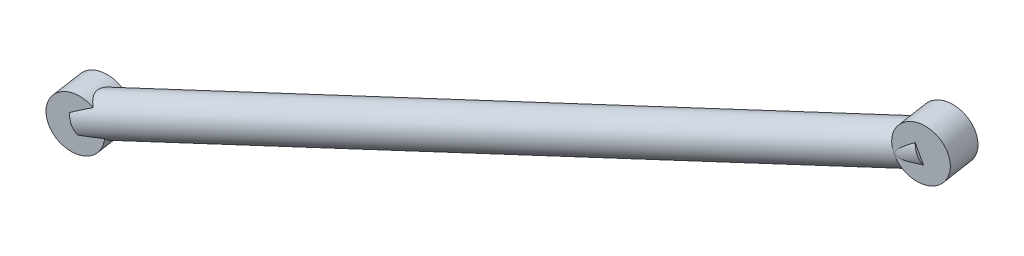
ISO-10303-21;
HEADER;
FILE_DESCRIPTION(('STEP AP214'),'2;1');
FILE_NAME('part.step','',(''),(''),'','','');
FILE_SCHEMA(('AUTOMOTIVE_DESIGN { 1 0 10303 214 1 1 1 1 }'));
ENDSEC;
DATA;
#1=APPLICATION_CONTEXT('core data for automotive mechanical design processes');
#2=APPLICATION_PROTOCOL_DEFINITION('international standard','automotive_design',2000,#1);
#3=PRODUCT_CONTEXT('',#1,'mechanical');
#4=PRODUCT('Part','Part','',(#3));
#5=PRODUCT_RELATED_PRODUCT_CATEGORY('part','',(#4));
#6=PRODUCT_DEFINITION_FORMATION('','',#4);
#7=PRODUCT_DEFINITION_CONTEXT('part definition',#1,'design');
#8=PRODUCT_DEFINITION('design','',#6,#7);
#9=PRODUCT_DEFINITION_SHAPE('','',#8);
#10=(LENGTH_UNIT() NAMED_UNIT(*) SI_UNIT(.MILLI.,.METRE.));
#11=(NAMED_UNIT(*) PLANE_ANGLE_UNIT() SI_UNIT($,.RADIAN.));
#12=(NAMED_UNIT(*) SI_UNIT($,.STERADIAN.) SOLID_ANGLE_UNIT());
#13=UNCERTAINTY_MEASURE_WITH_UNIT(LENGTH_MEASURE(1.E-05),#10,'distance_accuracy_value','');
#14=(GEOMETRIC_REPRESENTATION_CONTEXT(3) GLOBAL_UNCERTAINTY_ASSIGNED_CONTEXT((#13)) GLOBAL_UNIT_ASSIGNED_CONTEXT((#10,
#11,#12)) REPRESENTATION_CONTEXT('',''));
#15=CARTESIAN_POINT('',(0.,0.,0.));
#16=DIRECTION('',(0.,0.,1.));
#17=DIRECTION('',(1.,0.,0.));
#18=AXIS2_PLACEMENT_3D('',#15,#16,#17);
#19=CARTESIAN_POINT('',(175.,1319.6,-94.));
#20=DIRECTION('',(0.912250150157576,0.407836306683906,-0.0383302816048973));
#21=DIRECTION('',(-0.408136235908337,0.912921033243607,0.));
#22=AXIS2_PLACEMENT_3D('',#19,#20,#21);
#23=PLANE('',#22);
#24=DIRECTION('',(-0.405264883425802,0.9121907599121,0.060567250167539));
#25=VECTOR('',#24,1.);
#26=CARTESIAN_POINT('',(175.419638353964,1319.32065466055,-86.9849724910181));
#27=LINE('',#26,#25);
#28=CARTESIAN_POINT('',(176.964716176824,1315.84291511045,-87.2158859475072));
#29=VERTEX_POINT('',#28);
#30=CARTESIAN_POINT('',(173.874560531103,1322.79839421066,-86.7540590345291));
#31=VERTEX_POINT('',#30);
#32=EDGE_CURVE('E214',#29,#31,#27,.T.);
#33=ORIENTED_EDGE('',*,*,#32,.F.);
#34=CARTESIAN_POINT('',(175.,1319.6,-94.));
#35=DIRECTION('',(0.912250150157576,0.407836306683906,-0.0383302816048973));
#36=DIRECTION('',(-0.408136235908337,0.912921033243607,0.));
#37=AXIS2_PLACEMENT_3D('',#34,#35,#36);
#38=CIRCLE('',#37,8.00000000000001);
#39=EDGE_CURVE('E121',#31,#29,#38,.T.);
#40=ORIENTED_EDGE('',*,*,#39,.F.);
#41=EDGE_LOOP('',(#33,#40));
#42=FACE_BOUND('',#41,.T.);
#43=ADVANCED_FACE('F61',(#42),#23,.F.);
#44=CARTESIAN_POINT('',(175.,1319.6,-94.));
#45=DIRECTION('',(0.912250150157576,0.407836306683905,-0.0383302816048975));
#46=DIRECTION('',(-0.408136235908336,0.912921033243607,0.));
#47=AXIS2_PLACEMENT_3D('',#44,#45,#46);
#48=CYLINDRICAL_SURFACE('',#47,8.00000000000001);
#49=CARTESIAN_POINT('',(454.929916770915,1444.74723441423,-105.761897257689));
#50=DIRECTION('',(-0.147809429099499,0.,-0.989015860676299));
#51=DIRECTION('',(0.902171129515433,0.409765808152639,-0.134830395452446));
#52=AXIS2_PLACEMENT_3D('',#49,#50,#51);
#53=ELLIPSE('',#52,82.5338575678715,8.00000000000001);
#54=CARTESIAN_POINT('',(513.188387094106,1465.44539915011,-114.468685066726));
#55=VERTEX_POINT('',#54);
#56=CARTESIAN_POINT('',(521.935439468897,1471.00160578934,-115.775940965471));
#57=VERTEX_POINT('',#56);
#58=EDGE_CURVE('E82',#55,#57,#53,.F.);
#59=ORIENTED_EDGE('',*,*,#58,.F.);
#60=CARTESIAN_POINT('',(508.92760737851,1475.03577829605,-113.831907192557));
#61=CARTESIAN_POINT('',(508.94827239053,1475.14104204418,-113.747901744597));
#62=CARTESIAN_POINT('',(508.970602457118,1475.24457810792,-113.662175996066));
#63=CARTESIAN_POINT('',(509.018282818112,1475.44805471552,-113.487381054098));
#64=CARTESIAN_POINT('',(509.04363283287,1475.54799559118,-113.398312170759));
#65=CARTESIAN_POINT('',(509.123765085911,1475.84228360062,-113.126176103404));
#66=CARTESIAN_POINT('',(509.182620942872,1476.03105351941,-112.938213484238));
#67=CARTESIAN_POINT('',(509.309266939728,1476.39420062844,-112.547816686035));
#68=CARTESIAN_POINT('',(509.377144877647,1476.56840474467,-112.345250626928));
#69=CARTESIAN_POINT('',(509.518563829719,1476.8985204511,-111.927608114368));
#70=CARTESIAN_POINT('',(509.592103262384,1477.05443711925,-111.712535158683));
#71=CARTESIAN_POINT('',(509.723909066588,1477.31101409643,-111.322680807913));
#72=CARTESIAN_POINT('',(509.781630075913,1477.41597942264,-111.15053911796));
#73=CARTESIAN_POINT('',(509.89709097049,1477.61284825433,-110.798851994838));
#74=CARTESIAN_POINT('',(509.954830857211,1477.7047491542,-110.619305093942));
#75=CARTESIAN_POINT('',(510.068427374444,1477.873620096,-110.253595665571));
#76=CARTESIAN_POINT('',(510.124290265577,1477.95064493822,-110.067460528573));
#77=CARTESIAN_POINT('',(510.23252790108,1478.0883970531,-109.688290557377));
#78=CARTESIAN_POINT('',(510.284904120696,1478.14913125187,-109.495258695067));
#79=CARTESIAN_POINT('',(510.373254419953,1478.24093392383,-109.146595966626));
#80=CARTESIAN_POINT('',(510.410288182386,1478.27559507508,-108.992177453888));
#81=CARTESIAN_POINT('',(510.480249803723,1478.3330170309,-108.680283306352));
#82=CARTESIAN_POINT('',(510.513179741872,1478.35578388066,-108.522809266795));
#83=CARTESIAN_POINT('',(510.574199270502,1478.38867650542,-108.205737693436));
#84=CARTESIAN_POINT('',(510.602292802627,1478.39881261683,-108.046142004148));
#85=CARTESIAN_POINT('',(510.653161929173,1478.40597560667,-107.72580064502));
#86=CARTESIAN_POINT('',(510.675937484201,1478.403002388,-107.565054966671));
#87=CARTESIAN_POINT('',(510.715987812946,1478.38376410923,-107.24340209768));
#88=CARTESIAN_POINT('',(510.733253422397,1478.36747706384,-107.082495079894));
#89=CARTESIAN_POINT('',(510.762351168827,1478.32178872799,-106.762068779726));
#90=CARTESIAN_POINT('',(510.774183323274,1478.2923874797,-106.602549492883));
#91=CARTESIAN_POINT('',(510.792857392162,1478.22096406807,-106.285884385166));
#92=CARTESIAN_POINT('',(510.799693471077,1478.17892722666,-106.128741549078));
#93=CARTESIAN_POINT('',(510.809033135946,1478.08299464735,-105.817915502998));
#94=CARTESIAN_POINT('',(510.811534158082,1478.02909191301,-105.664234393312));
#95=CARTESIAN_POINT('',(510.813230146254,1477.89385782252,-105.319135187567));
#96=CARTESIAN_POINT('',(510.811316493742,1477.80906513074,-105.129065247495));
#97=CARTESIAN_POINT('',(510.803625343981,1477.62348581561,-104.756963249736));
#98=CARTESIAN_POINT('',(510.797846290203,1477.52269276168,-104.574934461565));
#99=CARTESIAN_POINT('',(510.784259376796,1477.30676985784,-104.21942808297));
#100=CARTESIAN_POINT('',(510.776449274001,1477.19162423009,-104.045960201154));
#101=CARTESIAN_POINT('',(510.760514660885,1476.94862341534,-103.708232095137));
#102=CARTESIAN_POINT('',(510.752390169488,1476.82076899264,-103.543971318156));
#103=CARTESIAN_POINT('',(510.737185150884,1476.55035297279,-103.221047435995));
#104=CARTESIAN_POINT('',(510.730135211964,1476.40750700896,-103.062621344287));
#105=CARTESIAN_POINT('',(510.718807922928,1476.11095991644,-102.75606508081));
#106=CARTESIAN_POINT('',(510.714531636833,1475.95725464698,-102.607938879687));
#107=CARTESIAN_POINT('',(510.710087740887,1475.64008692409,-102.322472967149));
#108=CARTESIAN_POINT('',(510.709919939745,1475.47662492529,-102.185132753833));
#109=CARTESIAN_POINT('',(510.714891779445,1475.14091229328,-101.921752850433));
#110=CARTESIAN_POINT('',(510.720031510886,1474.96866151008,-101.795713353294));
#111=CARTESIAN_POINT('',(510.738249398309,1474.58375247265,-101.533361544772));
#112=CARTESIAN_POINT('',(510.752618434016,1474.3695070987,-101.399451507119));
#113=CARTESIAN_POINT('',(510.791948971423,1473.93165833222,-101.149588266351));
#114=CARTESIAN_POINT('',(510.816911862281,1473.7080537159,-101.033637420924));
#115=CARTESIAN_POINT('',(510.878787543275,1473.2534846634,-100.821150626652));
#116=CARTESIAN_POINT('',(510.915694824227,1473.02252366444,-100.724605760286));
#117=CARTESIAN_POINT('',(511.002542294851,1472.55534160107,-100.55234779404));
#118=CARTESIAN_POINT('',(511.052479965676,1472.31912156133,-100.476630673845));
#119=CARTESIAN_POINT('',(511.160239811803,1471.86838560612,-100.354074557266));
#120=CARTESIAN_POINT('',(511.216721142409,1471.6541386701,-100.305065163351));
#121=CARTESIAN_POINT('',(511.340937389755,1471.22542096603,-100.225798481486));
#122=CARTESIAN_POINT('',(511.408671639686,1471.01095021201,-100.195540082918));
#123=CARTESIAN_POINT('',(511.555184122622,1470.58414999344,-100.154434706181));
#124=CARTESIAN_POINT('',(511.633951740191,1470.37181867853,-100.14356920617));
#125=CARTESIAN_POINT('',(511.802078106373,1469.9513037644,-100.141517852386));
#126=CARTESIAN_POINT('',(511.891435547733,1469.74311965692,-100.150329571965));
#127=CARTESIAN_POINT('',(512.066779825584,1469.36154266324,-100.184984008825));
#128=CARTESIAN_POINT('',(512.151509733652,1469.18733501247,-100.208290103269));
#129=CARTESIAN_POINT('',(512.327466087526,1468.84479796546,-100.269194727032));
#130=CARTESIAN_POINT('',(512.418692426906,1468.676468473,-100.306793022255));
#131=CARTESIAN_POINT('',(512.606782725153,1468.34678580389,-100.395848491438));
#132=CARTESIAN_POINT('',(512.703646602405,1468.18543252631,-100.447305464804));
#133=CARTESIAN_POINT('',(512.902066552696,1467.87058893025,-100.563495547532));
#134=CARTESIAN_POINT('',(513.003622814239,1467.71709892818,-100.628229190612));
#135=CARTESIAN_POINT('',(513.210208998126,1467.41898513579,-100.77014123475));
#136=CARTESIAN_POINT('',(513.315231306956,1467.27434367573,-100.847293637362));
#137=CARTESIAN_POINT('',(513.52793446366,1466.99404255133,-101.013403560402));
#138=CARTESIAN_POINT('',(513.635616181185,1466.85838587995,-101.10236498523));
#139=CARTESIAN_POINT('',(513.961005947855,1466.46552386831,-101.385755961767));
#140=CARTESIAN_POINT('',(514.181228069705,1466.22218555481,-101.596808736703));
#141=CARTESIAN_POINT('',(514.646935938207,1465.74600469671,-102.085700864432));
#142=CARTESIAN_POINT('',(514.892203844163,1465.51811882753,-102.368558603308));
#143=CARTESIAN_POINT('',(515.249682787173,1465.21100267882,-102.824411827434));
#144=CARTESIAN_POINT('',(515.36725848149,1465.11430800296,-102.981860370423));
#145=CARTESIAN_POINT('',(515.597277704326,1464.93222001145,-103.306702443493));
#146=CARTESIAN_POINT('',(515.709722652816,1464.84682355637,-103.474093192112));
#147=CARTESIAN_POINT('',(515.943280810777,1464.6755702913,-103.842862605121));
#148=CARTESIAN_POINT('',(516.063344775489,1464.59138312342,-104.045684801862));
#149=CARTESIAN_POINT('',(516.29152477494,1464.43670291749,-104.463057609484));
#150=CARTESIAN_POINT('',(516.399637455679,1464.36621371943,-104.677611487615));
#151=CARTESIAN_POINT('',(516.600115482204,1464.23855909154,-105.117189013176));
#152=CARTESIAN_POINT('',(516.69251534959,1464.18136434909,-105.342188288969));
#153=CARTESIAN_POINT('',(516.857716941731,1464.07963435594,-105.801992247924));
#154=CARTESIAN_POINT('',(516.930532083306,1464.03509043743,-106.036790090393));
#155=CARTESIAN_POINT('',(517.03112940157,1463.97148582232,-106.431954293339));
#156=CARTESIAN_POINT('',(517.065779877854,1463.9489365137,-106.59003172635));
#157=CARTESIAN_POINT('',(517.123553222489,1463.90896113658,-106.908901109632));
#158=CARTESIAN_POINT('',(517.146679723808,1463.89153345418,-107.06969218787));
#159=CARTESIAN_POINT('',(517.180311030557,1463.86172217906,-107.392799998716));
#160=CARTESIAN_POINT('',(517.19083640463,1463.84933038823,-107.555113808031));
#161=CARTESIAN_POINT('',(517.198563963947,1463.82945476166,-107.880374220758));
#162=CARTESIAN_POINT('',(517.195765953529,1463.82197099801,-108.043320833429));
#163=CARTESIAN_POINT('',(517.176476990976,1463.81180251712,-108.369052025174));
#164=CARTESIAN_POINT('',(517.159944557751,1463.80913241579,-108.531834615847));
#165=CARTESIAN_POINT('',(517.113299604495,1463.80854237065,-108.855440150396));
#166=CARTESIAN_POINT('',(517.083187297575,1463.8106223523,-109.016263124985));
#167=CARTESIAN_POINT('',(517.010004175856,1463.81945094657,-109.334912333248));
#168=CARTESIAN_POINT('',(516.966923827347,1463.82620299872,-109.492736271059));
#169=CARTESIAN_POINT('',(516.868816630217,1463.84431717366,-109.804413715384));
#170=CARTESIAN_POINT('',(516.813783565594,1463.85568169784,-109.958265109225));
#171=CARTESIAN_POINT('',(516.676333523091,1463.88675800202,-110.303137836716));
#172=CARTESIAN_POINT('',(516.590551274764,1463.90790825932,-110.492690480365));
#173=CARTESIAN_POINT('',(516.404279661776,1463.95767440638,-110.863422319406));
#174=CARTESIAN_POINT('',(516.303783771969,1463.98629361288,-111.044597752556));
#175=CARTESIAN_POINT('',(516.090249139468,1464.05124652989,-111.399014041634));
#176=CARTESIAN_POINT('',(515.977157564709,1464.08761336719,-111.572216813372));
#177=CARTESIAN_POINT('',(515.741159318536,1464.16817741555,-111.909786586446));
#178=CARTESIAN_POINT('',(515.618254471658,1464.21237317288,-112.074155220807));
#179=CARTESIAN_POINT('',(515.317249319819,1464.32690749622,-112.453981019695));
#180=CARTESIAN_POINT('',(515.13566914924,1464.40084684345,-112.66560927755));
#181=CARTESIAN_POINT('',(514.762035365107,1464.56496707543,-113.072762256814));
#182=CARTESIAN_POINT('',(514.569977784381,1464.65515414239,-113.268280807102));
#183=CARTESIAN_POINT('',(514.18135192718,1464.8516548972,-113.640827869998));
#184=CARTESIAN_POINT('',(513.984866074554,1464.95776079811,-113.818051073051));
#185=CARTESIAN_POINT('',(513.687574438672,1465.13034372337,-114.071487494115));
#186=CARTESIAN_POINT('',(513.588068532209,1465.19009654569,-114.153885955253));
#187=CARTESIAN_POINT('',(513.388531569595,1465.31423602692,-114.314471597459));
#188=CARTESIAN_POINT('',(513.288500461707,1465.3786231506,-114.392658354758));
#189=CARTESIAN_POINT('',(513.188387094106,1465.44539915011,-114.468685066726));
#190=B_SPLINE_CURVE_WITH_KNOTS('',3,(#60,#61,#62,#63,#64,#65,#66,#67,#68,#69,#70,#71,#72,#73,
#74,#75,#76,#77,#78,#79,#80,#81,#82,#83,#84,#85,#86,#87,#88,#89,#90,#91,#92,#93,#94,#95,#96,#97,
#98,#99,#100,#101,#102,#103,#104,#105,#106,#107,#108,#109,#110,#111,#112,#113,#114,#115,#116,
#117,#118,#119,#120,#121,#122,#123,#124,#125,#126,#127,#128,#129,#130,#131,#132,#133,#134,#135,
#136,#137,#138,#139,#140,#141,#142,#143,#144,#145,#146,#147,#148,#149,#150,#151,#152,#153,#154,
#155,#156,#157,#158,#159,#160,#161,#162,#163,#164,#165,#166,#167,#168,#169,#170,#171,#172,#173,
#174,#175,#176,#177,#178,#179,#180,#181,#182,#183,#184,#185,#186,#187,#188,#189),.UNSPECIFIED.,
.F.,.F.,(4,2,2,2,2,2,2,2,2,2,2,2,2,2,2,2,2,2,2,2,2,2,2,2,2,2,2,2,2,2,2,2,2,2,2,2,2,2,2,2,2,2,2,
2,2,2,2,2,2,2,2,2,2,2,2,2,2,2,2,2,2,2,2,2,4),(0.,0.408682242264113,0.817326669733562,
1.63478049720215,2.46086825513354,3.28672608429655,3.91541272958496,4.54422458639402,
5.17067389800407,5.79685644532747,6.28400064584877,6.77089701742648,7.25739467301195,
7.74389593226042,8.2312021844088,8.71850686989097,9.20637983228177,9.6945412317404,
10.3180211431972,10.9417522700553,11.5661752162147,12.190560632765,12.8303016713009,
13.4702879805195,14.1102444918356,14.750211927508,15.5083802863279,16.266648093455,
17.0245666573347,17.7823388197515,18.4621041593567,19.1418292327186,19.8209047635675,
20.4998965535665,21.0845411470313,21.669176164902,22.2538027210984,22.8384527836689,
23.4218944408868,24.0055294832906,25.1718591096603,26.4813856612201,27.1379421726912,
27.7943158612193,28.5442547071669,29.2944034839999,30.0428822459093,30.7908469372594,
31.2805847842234,31.7701681420377,32.2589512655469,32.747741567218,33.2380135170277,
33.7282777731729,34.2189033406532,34.7097846711704,35.3362294811975,35.9629529507342,
36.5924119223248,37.2217541329407,38.0859859476797,38.9505472979784,39.8046734058604,
40.2315802031332,40.6585298744864),.UNSPECIFIED.);
#191=CARTESIAN_POINT('',(508.92760737851,1475.03577829605,-113.831907192557));
#192=VERTEX_POINT('',#191);
#193=EDGE_CURVE('E12',#192,#55,#190,.T.);
#194=ORIENTED_EDGE('',*,*,#193,.F.);
#195=CARTESIAN_POINT('',(518.845283823176,1477.95708488955,-115.314114052493));
#196=VERTEX_POINT('',#195);
#197=EDGE_CURVE('E123',#196,#192,#53,.F.);
#198=ORIENTED_EDGE('',*,*,#197,.F.);
#199=CARTESIAN_POINT('',(520.81,1474.2,-108.53));
#200=DIRECTION('',(0.912250150157576,0.407836306683906,-0.0383302816048973));
#201=DIRECTION('',(-0.408136235908337,0.912921033243607,0.));
#202=AXIS2_PLACEMENT_3D('',#199,#200,#201);
#203=CIRCLE('',#202,8.00000000000001);
#204=EDGE_CURVE('E116',#57,#196,#203,.T.);
#205=ORIENTED_EDGE('',*,*,#204,.F.);
#206=EDGE_LOOP('',(#59,#194,#198,#205));
#207=FACE_BOUND('',#206,.T.);
#208=CARTESIAN_POINT('',(182.621612905893,1328.35460084989,-88.0613149332738));
#209=CARTESIAN_POINT('',(182.525784393692,1328.41851892123,-88.1340871194705));
#210=CARTESIAN_POINT('',(182.430030687432,1328.48024851067,-88.2088396301664));
#211=CARTESIAN_POINT('',(182.238989369884,1328.59945601721,-88.3622091309601));
#212=CARTESIAN_POINT('',(182.143701716289,1328.65693432719,-88.4408257628431));
#213=CARTESIAN_POINT('',(181.858947537276,1328.82321972981,-88.6823808746626));
#214=CARTESIAN_POINT('',(181.670628725055,1328.92585159876,-88.8509951231232));
#215=CARTESIAN_POINT('',(181.297922488417,1329.1165493608,-89.204617967528));
#216=CARTESIAN_POINT('',(181.113597595218,1329.20444995922,-89.3897809104008));
#217=CARTESIAN_POINT('',(180.754055502001,1329.36529688492,-89.7748246970473));
#218=CARTESIAN_POINT('',(180.578835781276,1329.43824736767,-89.974701429976));
#219=CARTESIAN_POINT('',(180.281484710925,1329.55428807415,-90.3398148718765));
#220=CARTESIAN_POINT('',(180.156666222703,1329.60034915749,-90.5019287751745));
#221=CARTESIAN_POINT('',(179.916310467954,1329.68460001337,-90.83495023406));
#222=CARTESIAN_POINT('',(179.80077505486,1329.7227882164,-91.0058595345927));
#223=CARTESIAN_POINT('',(179.581683348611,1329.79137119812,-91.3558025993684));
#224=CARTESIAN_POINT('',(179.478083678939,1329.82179471886,-91.5348034261259));
#225=CARTESIAN_POINT('',(179.284937720224,1329.87515856552,-91.9012837618177));
#226=CARTESIAN_POINT('',(179.195385465539,1329.89810207254,-92.0887596277698));
#227=CARTESIAN_POINT('',(179.051064991219,1329.93227991014,-92.429057556462));
#228=CARTESIAN_POINT('',(178.992988414514,1329.94498299282,-92.5803311991454));
#229=CARTESIAN_POINT('',(178.888240995336,1329.96585867557,-92.8870265737151));
#230=CARTESIAN_POINT('',(178.84156436536,1329.97403357718,-93.0424461561575));
#231=CARTESIAN_POINT('',(178.760703530428,1329.98580077126,-93.3565524260528));
#232=CARTESIAN_POINT('',(178.726509126815,1329.98939681091,-93.5152363338745));
#233=CARTESIAN_POINT('',(178.671327383945,1329.99194087668,-93.8349331680942));
#234=CARTESIAN_POINT('',(178.650340142518,1329.99088886837,-93.9959461117354));
#235=CARTESIAN_POINT('',(178.621879045706,1329.98404151595,-94.3193310032593));
#236=CARTESIAN_POINT('',(178.614427607804,1329.97823832612,-94.4817047589924));
#237=CARTESIAN_POINT('',(178.612937666501,1329.96178561356,-94.8062570737952));
#238=CARTESIAN_POINT('',(178.618899119978,1329.95113610641,-94.9684356334906));
#239=CARTESIAN_POINT('',(178.643620965312,1329.92488179271,-95.2915863048483));
#240=CARTESIAN_POINT('',(178.662396274715,1329.90927122195,-95.4525567890425));
#241=CARTESIAN_POINT('',(178.711794058067,1329.87299457287,-95.772161206666));
#242=CARTESIAN_POINT('',(178.742423529656,1329.85232551113,-95.9307937024305));
#243=CARTESIAN_POINT('',(178.824329555097,1329.79938394801,-96.2883873143777));
#244=CARTESIAN_POINT('',(178.878975917748,1329.76548318051,-96.4863382117627));
#245=CARTESIAN_POINT('',(179.003083124625,1329.68902732815,-96.875838707994));
#246=CARTESIAN_POINT('',(179.072549929098,1329.64646876175,-97.0673856954625));
#247=CARTESIAN_POINT('',(179.223865736315,1329.552384484,-97.443475797711));
#248=CARTESIAN_POINT('',(179.305728387472,1329.50084887899,-97.6280109084075));
#249=CARTESIAN_POINT('',(179.479513750537,1329.38855121752,-97.9893299699998));
#250=CARTESIAN_POINT('',(179.57143585751,1329.32778971578,-98.1661143860958));
#251=CARTESIAN_POINT('',(179.765727689889,1329.19510804957,-98.5158029752307));
#252=CARTESIAN_POINT('',(179.868298758704,1329.12295020816,-98.6885047972262));
#253=CARTESIAN_POINT('',(180.080110338608,1328.96823708763,-99.0250236424517));
#254=CARTESIAN_POINT('',(180.18935339162,1328.88567783284,-99.1888372339483));
#255=CARTESIAN_POINT('',(180.412824011614,1328.70984909336,-99.5070369137865));
#256=CARTESIAN_POINT('',(180.527051346278,1328.61658010752,-99.6614234407196));
#257=CARTESIAN_POINT('',(180.758994663591,1328.41903208472,-99.9602105559705));
#258=CARTESIAN_POINT('',(180.876710705759,1328.31475285984,-100.104610973779));
#259=CARTESIAN_POINT('',(181.136183242273,1328.07462220301,-100.408463899381));
#260=CARTESIAN_POINT('',(181.27836426475,1327.93649676375,-100.565770502899));
#261=CARTESIAN_POINT('',(181.5634137017,1327.64421462718,-100.864112661678));
#262=CARTESIAN_POINT('',(181.706282203892,1327.49005582944,-101.005146079972));
#263=CARTESIAN_POINT('',(181.990389250465,1327.165869406,-101.269340345755));
#264=CARTESIAN_POINT('',(182.131628515266,1326.99584912187,-101.39250939508));
#265=CARTESIAN_POINT('',(182.410266910377,1326.64037705645,-101.619389596728));
#266=CARTESIAN_POINT('',(182.547666777187,1326.45492826229,-101.723104502992));
#267=CARTESIAN_POINT('',(182.802542461782,1326.08942576736,-101.899856869499));
#268=CARTESIAN_POINT('',(182.920613264368,1325.91078190645,-101.97495325775));
#269=CARTESIAN_POINT('',(183.150283915013,1325.54295302677,-102.107108697457));
#270=CARTESIAN_POINT('',(183.261884145968,1325.35376863305,-102.164168817101));
#271=CARTESIAN_POINT('',(183.477038101982,1324.96651168241,-102.259325612011));
#272=CARTESIAN_POINT('',(183.580599414341,1324.76844779174,-102.297440356562));
#273=CARTESIAN_POINT('',(183.778509333543,1324.36506966462,-102.354196206526));
#274=CARTESIAN_POINT('',(183.872859074885,1324.15975632526,-102.372839712769));
#275=CARTESIAN_POINT('',(184.038934907338,1323.77284761341,-102.389210859617));
#276=CARTESIAN_POINT('',(184.111982927703,1323.59192069832,-102.389484837498));
#277=CARTESIAN_POINT('',(184.250071913327,1323.22758856272,-102.375514610026));
#278=CARTESIAN_POINT('',(184.315113009711,1323.04418338286,-102.361270642459));
#279=CARTESIAN_POINT('',(184.436931784723,1322.67630698726,-102.318531400359));
#280=CARTESIAN_POINT('',(184.493709582938,1322.491835787,-102.290036332094));
#281=CARTESIAN_POINT('',(184.598952478896,1322.123179643,-102.21922897145));
#282=CARTESIAN_POINT('',(184.647417242314,1321.93899471107,-102.176916123561));
#283=CARTESIAN_POINT('',(184.736069763931,1321.57257024678,-102.079127805082));
#284=CARTESIAN_POINT('',(184.776274422719,1321.39032748033,-102.023679720902));
#285=CARTESIAN_POINT('',(184.848837247398,1321.02853746143,-101.900203089729));
#286=CARTESIAN_POINT('',(184.881192808106,1320.84899112245,-101.83217037896));
#287=CARTESIAN_POINT('',(184.967064511789,1320.3161649521,-101.610242848623));
#288=CARTESIAN_POINT('',(185.009455768823,1319.96839974925,-101.438437911007));
#289=CARTESIAN_POINT('',(185.072791763669,1319.25378183975,-101.02861192824));
#290=CARTESIAN_POINT('',(185.090464389971,1318.88982781917,-100.785050920089));
#291=CARTESIAN_POINT('',(185.099857117083,1318.37117060028,-100.384027041245));
#292=CARTESIAN_POINT('',(185.100123952619,1318.20261933144,-100.244190184532));
#293=CARTESIAN_POINT('',(185.096236446012,1317.87571858372,-99.9531437270899));
#294=CARTESIAN_POINT('',(185.092083334956,1317.71736627714,-99.8019373040257));
#295=CARTESIAN_POINT('',(185.079965082485,1317.39019136862,-99.4662623107434));
#296=CARTESIAN_POINT('',(185.071540933095,1317.22309397635,-99.2801247982671));
#297=CARTESIAN_POINT('',(185.053166822129,1316.90553244441,-98.894107694665));
#298=CARTESIAN_POINT('',(185.04321643409,1316.75507297398,-98.6942242712959));
#299=CARTESIAN_POINT('',(185.024553265991,1316.47348949452,-98.2818191617644));
#300=CARTESIAN_POINT('',(185.015837780028,1316.3423231857,-98.0693266021261));
#301=CARTESIAN_POINT('',(185.002688836728,1316.10180536275,-97.632247066623));
#302=CARTESIAN_POINT('',(184.998252442517,1315.99243892764,-97.4076684976888));
#303=CARTESIAN_POINT('',(184.997125048911,1315.83215158993,-97.027370176435));
#304=CARTESIAN_POINT('',(184.998288809193,1315.77408839792,-96.8746452176064));
#305=CARTESIAN_POINT('',(185.004702710193,1315.66958786616,-96.5653686836509));
#306=CARTESIAN_POINT('',(185.009951561736,1315.62314686477,-96.4088183308384));
#307=CARTESIAN_POINT('',(185.025270505377,1315.54277843292,-96.0930261848389));
#308=CARTESIAN_POINT('',(185.035332703033,1315.50883067283,-95.933789209117));
#309=CARTESIAN_POINT('',(185.060806226224,1315.4539756185,-95.6134907320332));
#310=CARTESIAN_POINT('',(185.076217630312,1315.43306851577,-95.4524292039111));
#311=CARTESIAN_POINT('',(185.112679366243,1315.40458364711,-95.1292645006623));
#312=CARTESIAN_POINT('',(185.133746649507,1315.3970464779,-94.9671596479528));
#313=CARTESIAN_POINT('',(185.18139225813,1315.39538419718,-94.6437036623685));
#314=CARTESIAN_POINT('',(185.207970497002,1315.40125887518,-94.4823525177056));
#315=CARTESIAN_POINT('',(185.266229978415,1315.42602116763,-94.1614729561779));
#316=CARTESIAN_POINT('',(185.297914967295,1315.44491836906,-94.0019459702479));
#317=CARTESIAN_POINT('',(185.365703861566,1315.49504616834,-93.6857374246377));
#318=CARTESIAN_POINT('',(185.401810061929,1315.52628319045,-93.5290573916298));
#319=CARTESIAN_POINT('',(185.488064450487,1315.61044066147,-93.1765334214406));
#320=CARTESIAN_POINT('',(185.539336837971,1315.66696694975,-92.981823243891));
#321=CARTESIAN_POINT('',(185.645826907746,1315.7967771477,-92.5991679718455));
#322=CARTESIAN_POINT('',(185.701046334864,1315.87006850044,-92.4112259251681));
#323=CARTESIAN_POINT('',(185.813814675855,1316.03192546453,-92.04175001105));
#324=CARTESIAN_POINT('',(185.871372705398,1316.12055634819,-91.8602476943401));
#325=CARTESIAN_POINT('',(185.986856596148,1316.31125212506,-91.5046669279324));
#326=CARTESIAN_POINT('',(186.044782387143,1316.4133145233,-91.3305871073956));
#327=CARTESIAN_POINT('',(186.180877991491,1316.6699669758,-90.9261154084397));
#328=CARTESIAN_POINT('',(186.258534374258,1316.82994456254,-90.6989556345026));
#329=CARTESIAN_POINT('',(186.408081419489,1317.17021013108,-90.258312663558));
#330=CARTESIAN_POINT('',(186.479969872167,1317.35050583407,-90.0448347145195));
#331=CARTESIAN_POINT('',(186.613944756178,1317.72718640892,-89.6342298039558));
#332=CARTESIAN_POINT('',(186.676139024724,1317.92335081847,-89.4369365866944));
#333=CARTESIAN_POINT('',(186.760617589923,1318.22977834935,-89.1516950351635));
#334=CARTESIAN_POINT('',(186.787304226541,1318.33393083393,-89.0584136598769));
#335=CARTESIAN_POINT('',(186.837397347325,1318.54616713362,-88.8754934830886));
#336=CARTESIAN_POINT('',(186.860803501798,1318.6542513425,-88.7858550483498));
#337=CARTESIAN_POINT('',(186.88239262149,1318.76422170395,-88.6980928074431));
#338=B_SPLINE_CURVE_WITH_KNOTS('',3,(#208,#209,#210,#211,#212,#213,#214,#215,#216,#217,#218,
#219,#220,#221,#222,#223,#224,#225,#226,#227,#228,#229,#230,#231,#232,#233,#234,#235,#236,#237,
#238,#239,#240,#241,#242,#243,#244,#245,#246,#247,#248,#249,#250,#251,#252,#253,#254,#255,#256,
#257,#258,#259,#260,#261,#262,#263,#264,#265,#266,#267,#268,#269,#270,#271,#272,#273,#274,#275,
#276,#277,#278,#279,#280,#281,#282,#283,#284,#285,#286,#287,#288,#289,#290,#291,#292,#293,#294,
#295,#296,#297,#298,#299,#300,#301,#302,#303,#304,#305,#306,#307,#308,#309,#310,#311,#312,#313,
#314,#315,#316,#317,#318,#319,#320,#321,#322,#323,#324,#325,#326,#327,#328,#329,#330,#331,#332,
#333,#334,#335,#336,#337),.UNSPECIFIED.,.F.,.F.,(4,2,2,2,2,2,2,2,2,2,2,2,2,2,2,2,2,2,2,2,2,2,2,
2,2,2,2,2,2,2,2,2,2,2,2,2,2,2,2,2,2,2,2,2,2,2,2,2,2,2,2,2,2,2,2,2,2,2,2,2,2,2,2,2,4),(0.,
0.408682242264108,0.817326669733467,1.63478049720193,2.46086825513329,3.28672608429621,
3.91541272958459,4.54422458639361,5.17067389800372,5.79685644532718,6.28400064584837,
6.77089701742619,7.25739467301168,7.74389593226019,8.2312021844085,8.71850686989072,
9.20637983228153,9.69454123174014,10.3180211431971,10.9417522700551,11.5661752162142,
12.1905606327648,12.8303016713006,13.4702879805192,14.1102444918356,14.7502119275077,
15.5083802863277,16.2666480934548,17.0245666573347,17.7823388197515,18.4621041593571,
19.1418292327187,19.8209047635676,20.4998965535664,21.0845411470311,21.6691761649018,
22.2538027210983,22.8384527836684,23.4218944408865,24.0055294832904,25.1718591096601,
26.4813856612198,27.1379421726909,27.794315861219,28.5442547071666,29.2944034839997,
30.0428822459092,30.7908469372593,31.2805847842233,31.7701681420376,32.2589512655468,
32.7477415672179,33.2380135170275,33.7282777731728,34.218903340653,34.7097846711703,
35.3362294811973,35.962952950734,36.5924119223249,37.2217541329407,38.0859859476794,
38.9505472979781,39.8046734058601,40.2315802031329,40.6585298744858),.UNSPECIFIED.);
#339=CARTESIAN_POINT('',(182.621612905893,1328.35460084989,-88.0613149332738));
#340=VERTEX_POINT('',#339);
#341=CARTESIAN_POINT('',(186.88239262149,1318.76422170395,-88.698092807443));
#342=VERTEX_POINT('',#341);
#343=EDGE_CURVE('E141',#340,#342,#338,.T.);
#344=ORIENTED_EDGE('',*,*,#343,.F.);
#345=CARTESIAN_POINT('',(240.880083229081,1349.05276558577,-96.7681027423109));
#346=DIRECTION('',(-0.147809429099505,0.,-0.989015860676298));
#347=DIRECTION('',(0.902171129515432,0.409765808152639,-0.134830395452451));
#348=AXIS2_PLACEMENT_3D('',#345,#346,#347);
#349=ELLIPSE('',#348,82.533857567867,8.00000000000001);
#350=EDGE_CURVE('E136',#340,#31,#349,.F.);
#351=ORIENTED_EDGE('',*,*,#350,.T.);
#352=ORIENTED_EDGE('',*,*,#39,.T.);
#353=EDGE_CURVE('E139',#29,#342,#349,.F.);
#354=ORIENTED_EDGE('',*,*,#353,.T.);
#355=EDGE_LOOP('',(#344,#351,#352,#354));
#356=FACE_BOUND('',#355,.T.);
#357=ADVANCED_FACE('F124',(#207,#356),#48,.T.);
#358=CARTESIAN_POINT('',(520.81,1474.2,-108.53));
#359=DIRECTION('',(0.912250150157576,0.407836306683906,-0.0383302816048973));
#360=DIRECTION('',(-0.408136235908337,0.912921033243607,0.));
#361=AXIS2_PLACEMENT_3D('',#358,#359,#360);
#362=PLANE('',#361);
#363=DIRECTION('',(-0.405264883425802,0.9121907599121,0.0605672501675366));
#364=VECTOR('',#363,1.);
#365=CARTESIAN_POINT('',(520.390361646036,1474.47934533945,-115.545027508982));
#366=LINE('',#365,#364);
#367=EDGE_CURVE('E119',#57,#196,#366,.T.);
#368=ORIENTED_EDGE('',*,*,#367,.F.);
#369=ORIENTED_EDGE('',*,*,#204,.T.);
#370=EDGE_LOOP('',(#368,#369));
#371=FACE_BOUND('',#370,.T.);
#372=ADVANCED_FACE('F117',(#371),#362,.T.);
#373=CARTESIAN_POINT('',(173.965334,1319.6,-100.923111));
#374=DIRECTION('',(-0.147809429099505,0.,-0.989015860676298));
#375=DIRECTION('',(-0.989015860676298,0.,0.147809429099505));
#376=AXIS2_PLACEMENT_3D('',#373,#374,#375);
#377=PLANE('',#376);
#378=CARTESIAN_POINT('',(173.965334,1319.6,-100.923111));
#379=DIRECTION('',(-0.147809429099505,0.,-0.989015860676298));
#380=DIRECTION('',(-0.989015860676298,0.,0.147809429099505));
#381=AXIS2_PLACEMENT_3D('',#378,#379,#380);
#382=CIRCLE('',#381,11.);
#383=CARTESIAN_POINT('',(163.086159532561,1319.6,-99.2972072799055));
#384=VERTEX_POINT('',#383);
#385=EDGE_CURVE('E208',#384,#384,#382,.T.);
#386=ORIENTED_EDGE('',*,*,#385,.T.);
#387=EDGE_LOOP('',(#386));
#388=FACE_BOUND('',#387,.T.);
#389=DIRECTION('',(-0.405264883425802,0.9121907599121,0.060567250167539));
#390=VECTOR('',#389,1.);
#391=CARTESIAN_POINT('',(174.580361646037,1319.87934533945,-101.015027508982));
#392=LINE('',#391,#390);
#393=CARTESIAN_POINT('',(176.125439468897,1316.40160578934,-101.245940965471));
#394=VERTEX_POINT('',#393);
#395=CARTESIAN_POINT('',(173.035283823176,1323.35708488955,-100.784114052493));
#396=VERTEX_POINT('',#395);
#397=EDGE_CURVE('E211',#394,#396,#392,.T.);
#398=ORIENTED_EDGE('',*,*,#397,.F.);
#399=CARTESIAN_POINT('',(109.119916770919,1290.14723441423,-91.2318972576891));
#400=DIRECTION('',(-0.147809429099505,0.,-0.989015860676298));
#401=DIRECTION('',(0.902171129515432,0.409765808152639,-0.134830395452451));
#402=AXIS2_PLACEMENT_3D('',#399,#400,#401);
#403=ELLIPSE('',#402,82.533857567867,8.00000000000001);
#404=EDGE_CURVE('E132',#394,#396,#403,.F.);
#405=ORIENTED_EDGE('',*,*,#404,.T.);
#406=EDGE_LOOP('',(#398,#405));
#407=FACE_BOUND('',#406,.T.);
#408=ADVANCED_FACE('F159',(#388,#407),#377,.T.);
#409=CARTESIAN_POINT('',(176.034666,1319.6,-87.076889));
#410=DIRECTION('',(-0.147809429099505,0.,-0.989015860676298));
#411=DIRECTION('',(-0.989015860676298,0.,0.147809429099505));
#412=AXIS2_PLACEMENT_3D('',#409,#410,#411);
#413=PLANE('',#412);
#414=ORIENTED_EDGE('',*,*,#350,.F.);
#415=CARTESIAN_POINT('',(176.034666,1319.6,-87.076889));
#416=DIRECTION('',(-0.147809429099505,0.,-0.989015860676298));
#417=DIRECTION('',(-0.989015860676298,0.,0.147809429099505));
#418=AXIS2_PLACEMENT_3D('',#415,#416,#417);
#419=CIRCLE('',#418,11.);
#420=EDGE_CURVE('E205',#342,#340,#419,.T.);
#421=ORIENTED_EDGE('',*,*,#420,.F.);
#422=ORIENTED_EDGE('',*,*,#353,.F.);
#423=ORIENTED_EDGE('',*,*,#32,.T.);
#424=EDGE_LOOP('',(#414,#421,#422,#423));
#425=FACE_BOUND('',#424,.T.);
#426=ADVANCED_FACE('F157',(#425),#413,.F.);
#427=CARTESIAN_POINT('',(176.034666,1319.6,-87.076889));
#428=DIRECTION('',(-0.147809429099506,0.,-0.989015860676298));
#429=DIRECTION('',(-0.989015860676298,0.,0.147809429099506));
#430=AXIS2_PLACEMENT_3D('',#427,#428,#429);
#431=CYLINDRICAL_SURFACE('',#430,11.);
#432=ORIENTED_EDGE('',*,*,#385,.F.);
#433=EDGE_LOOP('',(#432));
#434=FACE_BOUND('',#433,.T.);
#435=ORIENTED_EDGE('',*,*,#420,.T.);
#436=ORIENTED_EDGE('',*,*,#343,.T.);
#437=EDGE_LOOP('',(#435,#436));
#438=FACE_BOUND('',#437,.T.);
#439=ADVANCED_FACE('F152',(#434,#438),#431,.T.);
#440=ORIENTED_EDGE('',*,*,#404,.F.);
#441=EDGE_CURVE('E216',#394,#396,#38,.T.);
#442=ORIENTED_EDGE('',*,*,#441,.T.);
#443=EDGE_LOOP('',(#440,#442));
#444=FACE_BOUND('',#443,.T.);
#445=ADVANCED_FACE('F149',(#444),#48,.T.);
#446=ORIENTED_EDGE('',*,*,#441,.F.);
#447=ORIENTED_EDGE('',*,*,#397,.T.);
#448=EDGE_LOOP('',(#446,#447));
#449=FACE_BOUND('',#448,.T.);
#450=ADVANCED_FACE('F63',(#449),#23,.F.);
#451=CARTESIAN_POINT('',(521.844666,1474.2,-101.606889));
#452=DIRECTION('',(-0.147809429099499,0.,-0.989015860676299));
#453=DIRECTION('',(-0.989015860676299,0.,0.147809429099499));
#454=AXIS2_PLACEMENT_3D('',#451,#452,#453);
#455=PLANE('',#454);
#456=CARTESIAN_POINT('',(586.690083229084,1503.65276558577,-111.298102742311));
#457=DIRECTION('',(-0.147809429099499,0.,-0.989015860676299));
#458=DIRECTION('',(0.902171129515433,0.409765808152639,-0.134830395452446));
#459=AXIS2_PLACEMENT_3D('',#456,#457,#458);
#460=ELLIPSE('',#459,82.5338575678715,8.00000000000001);
#461=CARTESIAN_POINT('',(519.684560531103,1477.39839421066,-101.284059034529));
#462=VERTEX_POINT('',#461);
#463=CARTESIAN_POINT('',(522.774716176824,1470.44291511045,-101.745885947507));
#464=VERTEX_POINT('',#463);
#465=EDGE_CURVE('E202',#462,#464,#460,.F.);
#466=ORIENTED_EDGE('',*,*,#465,.F.);
#467=DIRECTION('',(-0.405264883425802,0.9121907599121,0.0605672501675366));
#468=VECTOR('',#467,1.);
#469=CARTESIAN_POINT('',(521.229638353964,1473.92065466055,-101.514972491018));
#470=LINE('',#469,#468);
#471=EDGE_CURVE('E75',#464,#462,#470,.T.);
#472=ORIENTED_EDGE('',*,*,#471,.F.);
#473=EDGE_LOOP('',(#466,#472));
#474=FACE_BOUND('',#473,.T.);
#475=CARTESIAN_POINT('',(521.844666,1474.2,-101.606889));
#476=DIRECTION('',(-0.147809429099499,0.,-0.989015860676299));
#477=DIRECTION('',(-0.989015860676299,0.,0.147809429099499));
#478=AXIS2_PLACEMENT_3D('',#475,#476,#477);
#479=CIRCLE('',#478,11.);
#480=CARTESIAN_POINT('',(510.965491532561,1474.2,-99.9809852799055));
#481=VERTEX_POINT('',#480);
#482=EDGE_CURVE('E197',#481,#481,#479,.T.);
#483=ORIENTED_EDGE('',*,*,#482,.F.);
#484=EDGE_LOOP('',(#483));
#485=FACE_BOUND('',#484,.T.);
#486=ADVANCED_FACE('F160',(#474,#485),#455,.F.);
#487=CARTESIAN_POINT('',(519.775334,1474.2,-115.453111));
#488=DIRECTION('',(-0.147809429099499,0.,-0.989015860676299));
#489=DIRECTION('',(-0.989015860676299,0.,0.147809429099499));
#490=AXIS2_PLACEMENT_3D('',#487,#488,#489);
#491=PLANE('',#490);
#492=CARTESIAN_POINT('',(519.775334,1474.2,-115.453111));
#493=DIRECTION('',(-0.147809429099499,0.,-0.989015860676299));
#494=DIRECTION('',(-0.989015860676299,0.,0.147809429099499));
#495=AXIS2_PLACEMENT_3D('',#492,#493,#494);
#496=CIRCLE('',#495,11.);
#497=EDGE_CURVE('E129',#192,#55,#496,.T.);
#498=ORIENTED_EDGE('',*,*,#497,.T.);
#499=ORIENTED_EDGE('',*,*,#58,.T.);
#500=ORIENTED_EDGE('',*,*,#367,.T.);
#501=ORIENTED_EDGE('',*,*,#197,.T.);
#502=EDGE_LOOP('',(#498,#499,#500,#501));
#503=FACE_BOUND('',#502,.T.);
#504=ADVANCED_FACE('F131',(#503),#491,.T.);
#505=CARTESIAN_POINT('',(521.844666,1474.2,-101.606889));
#506=DIRECTION('',(-0.147809429099507,0.,-0.989015860676298));
#507=DIRECTION('',(-0.989015860676298,0.,0.147809429099507));
#508=AXIS2_PLACEMENT_3D('',#505,#506,#507);
#509=CYLINDRICAL_SURFACE('',#508,11.);
#510=ORIENTED_EDGE('',*,*,#497,.F.);
#511=ORIENTED_EDGE('',*,*,#193,.T.);
#512=EDGE_LOOP('',(#510,#511));
#513=FACE_BOUND('',#512,.T.);
#514=ORIENTED_EDGE('',*,*,#482,.T.);
#515=EDGE_LOOP('',(#514));
#516=FACE_BOUND('',#515,.T.);
#517=ADVANCED_FACE('F179',(#513,#516),#509,.T.);
#518=EDGE_CURVE('E120',#462,#464,#203,.T.);
#519=ORIENTED_EDGE('',*,*,#518,.T.);
#520=ORIENTED_EDGE('',*,*,#471,.T.);
#521=EDGE_LOOP('',(#519,#520));
#522=FACE_BOUND('',#521,.T.);
#523=ADVANCED_FACE('F184',(#522),#362,.T.);
#524=ORIENTED_EDGE('',*,*,#518,.F.);
#525=ORIENTED_EDGE('',*,*,#465,.T.);
#526=EDGE_LOOP('',(#524,#525));
#527=FACE_BOUND('',#526,.T.);
#528=ADVANCED_FACE('F171',(#527),#48,.T.);
#529=CLOSED_SHELL('',(#43,#357,#372,#408,#426,#439,#445,#450,#486,#504,#517,#523,#528));
#530=MANIFOLD_SOLID_BREP('B2',#529);
#531=ADVANCED_BREP_SHAPE_REPRESENTATION('',(#18,#530),#14);
#532=SHAPE_DEFINITION_REPRESENTATION(#9,#531);
ENDSEC;
END-ISO-10303-21;
